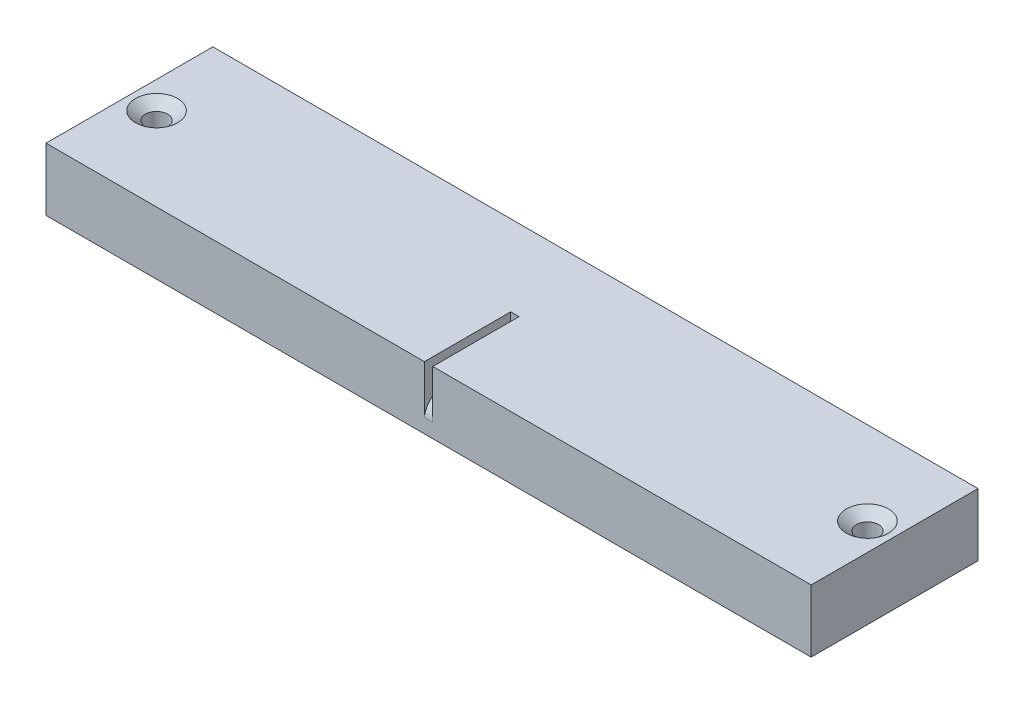
ISO-10303-21;
HEADER;
FILE_DESCRIPTION(('STEP AP214'),'2;1');
FILE_NAME('part.step','',(''),(''),'','','');
FILE_SCHEMA(('AUTOMOTIVE_DESIGN { 1 0 10303 214 1 1 1 1 }'));
ENDSEC;
DATA;
#1=APPLICATION_CONTEXT('core data for automotive mechanical design processes');
#2=APPLICATION_PROTOCOL_DEFINITION('international standard','automotive_design',2000,#1);
#3=PRODUCT_CONTEXT('',#1,'mechanical');
#4=PRODUCT('Part','Part','',(#3));
#5=PRODUCT_RELATED_PRODUCT_CATEGORY('part','',(#4));
#6=PRODUCT_DEFINITION_FORMATION('','',#4);
#7=PRODUCT_DEFINITION_CONTEXT('part definition',#1,'design');
#8=PRODUCT_DEFINITION('design','',#6,#7);
#9=PRODUCT_DEFINITION_SHAPE('','',#8);
#10=(LENGTH_UNIT() NAMED_UNIT(*) SI_UNIT(.MILLI.,.METRE.));
#11=(NAMED_UNIT(*) PLANE_ANGLE_UNIT() SI_UNIT($,.RADIAN.));
#12=(NAMED_UNIT(*) SI_UNIT($,.STERADIAN.) SOLID_ANGLE_UNIT());
#13=UNCERTAINTY_MEASURE_WITH_UNIT(LENGTH_MEASURE(1.E-05),#10,'distance_accuracy_value','');
#14=(GEOMETRIC_REPRESENTATION_CONTEXT(3) GLOBAL_UNCERTAINTY_ASSIGNED_CONTEXT((#13)) GLOBAL_UNIT_ASSIGNED_CONTEXT((#10,
#11,#12)) REPRESENTATION_CONTEXT('',''));
#15=CARTESIAN_POINT('',(0.,0.,0.));
#16=DIRECTION('',(0.,0.,1.));
#17=DIRECTION('',(1.,0.,0.));
#18=AXIS2_PLACEMENT_3D('',#15,#16,#17);
#19=CARTESIAN_POINT('',(-45.86,82.5,-0.0100000000000031));
#20=DIRECTION('',(0.,-1.,0.));
#21=DIRECTION('',(0.,0.,-1.));
#22=AXIS2_PLACEMENT_3D('',#19,#20,#21);
#23=PLANE('',#22);
#24=CARTESIAN_POINT('',(42.61,82.5,10.));
#25=DIRECTION('',(0.,-1.,0.));
#26=DIRECTION('',(0.,0.,-1.));
#27=AXIS2_PLACEMENT_3D('',#24,#25,#26);
#28=CIRCLE('',#27,1.3208);
#29=CARTESIAN_POINT('',(42.61,82.5,8.6792));
#30=VERTEX_POINT('',#29);
#31=EDGE_CURVE('E150',#30,#30,#28,.F.);
#32=ORIENTED_EDGE('',*,*,#31,.T.);
#33=EDGE_LOOP('',(#32));
#34=FACE_BOUND('',#33,.T.);
#35=DIRECTION('',(1.,0.,0.));
#36=VECTOR('',#35,1.);
#37=CARTESIAN_POINT('',(-38.36,82.5,0.));
#38=LINE('',#37,#36);
#39=CARTESIAN_POINT('',(-45.86,82.5,0.));
#40=VERTEX_POINT('',#39);
#41=CARTESIAN_POINT('',(45.86,82.5,0.));
#42=VERTEX_POINT('',#41);
#43=EDGE_CURVE('E124',#40,#42,#38,.T.);
#44=ORIENTED_EDGE('',*,*,#43,.T.);
#45=DIRECTION('',(0.,0.,1.));
#46=VECTOR('',#45,1.);
#47=CARTESIAN_POINT('',(45.86,82.5,-0.0100000000000031));
#48=LINE('',#47,#46);
#49=CARTESIAN_POINT('',(45.86,82.5,20.));
#50=VERTEX_POINT('',#49);
#51=EDGE_CURVE('E127',#42,#50,#48,.T.);
#52=ORIENTED_EDGE('',*,*,#51,.T.);
#53=DIRECTION('',(1.,0.,0.));
#54=VECTOR('',#53,1.);
#55=CARTESIAN_POINT('',(-38.36,82.5,20.));
#56=LINE('',#55,#54);
#57=CARTESIAN_POINT('',(-45.86,82.5,20.));
#58=VERTEX_POINT('',#57);
#59=EDGE_CURVE('E134',#58,#50,#56,.T.);
#60=ORIENTED_EDGE('',*,*,#59,.F.);
#61=DIRECTION('',(0.,0.,-1.));
#62=VECTOR('',#61,1.);
#63=CARTESIAN_POINT('',(-45.86,82.5,20.));
#64=LINE('',#63,#62);
#65=EDGE_CURVE('E129',#58,#40,#64,.T.);
#66=ORIENTED_EDGE('',*,*,#65,.T.);
#67=EDGE_LOOP('',(#44,#52,#60,#66));
#68=FACE_BOUND('',#67,.T.);
#69=DIRECTION('',(0.,0.,-1.));
#70=VECTOR('',#69,1.);
#71=CARTESIAN_POINT('',(0.499999999999992,82.5,9.65399692917009));
#72=LINE('',#71,#70);
#73=CARTESIAN_POINT('',(0.499999999999992,82.5,10.4024795225248));
#74=VERTEX_POINT('',#73);
#75=CARTESIAN_POINT('',(0.499999999999992,82.5,9.65399692917009));
#76=VERTEX_POINT('',#75);
#77=EDGE_CURVE('E196',#74,#76,#72,.T.);
#78=ORIENTED_EDGE('',*,*,#77,.T.);
#79=DIRECTION('',(1.,0.,0.));
#80=VECTOR('',#79,1.);
#81=CARTESIAN_POINT('',(-0.500000000000008,82.5,9.65399692917009));
#82=LINE('',#81,#80);
#83=CARTESIAN_POINT('',(-0.500000000000008,82.5,9.65399692917009));
#84=VERTEX_POINT('',#83);
#85=EDGE_CURVE('E65',#84,#76,#82,.T.);
#86=ORIENTED_EDGE('',*,*,#85,.F.);
#87=DIRECTION('',(0.,0.,-1.));
#88=VECTOR('',#87,1.);
#89=CARTESIAN_POINT('',(-0.500000000000008,82.5,9.65399692917009));
#90=LINE('',#89,#88);
#91=CARTESIAN_POINT('',(-0.500000000000007,82.5,10.4024795225248));
#92=VERTEX_POINT('',#91);
#93=EDGE_CURVE('E234',#92,#84,#90,.T.);
#94=ORIENTED_EDGE('',*,*,#93,.F.);
#95=DIRECTION('',(1.,0.,0.));
#96=VECTOR('',#95,1.);
#97=CARTESIAN_POINT('',(-0.500000000000008,82.5,10.4024795225248));
#98=LINE('',#97,#96);
#99=EDGE_CURVE('E73',#92,#74,#98,.T.);
#100=ORIENTED_EDGE('',*,*,#99,.T.);
#101=EDGE_LOOP('',(#78,#86,#94,#100));
#102=FACE_BOUND('',#101,.T.);
#103=CARTESIAN_POINT('',(-42.61,82.5,10.));
#104=DIRECTION('',(0.,-1.,0.));
#105=DIRECTION('',(0.,0.,-1.));
#106=AXIS2_PLACEMENT_3D('',#103,#104,#105);
#107=CIRCLE('',#106,1.3208);
#108=CARTESIAN_POINT('',(-42.61,82.5,8.6792));
#109=VERTEX_POINT('',#108);
#110=EDGE_CURVE('E157',#109,#109,#107,.F.);
#111=ORIENTED_EDGE('',*,*,#110,.T.);
#112=EDGE_LOOP('',(#111));
#113=FACE_BOUND('',#112,.T.);
#114=ADVANCED_FACE('F47',(#34,#68,#102,#113),#23,.T.);
#115=CARTESIAN_POINT('',(-45.86,90.,20.));
#116=DIRECTION('',(0.,1.,0.));
#117=DIRECTION('',(0.,0.,1.));
#118=AXIS2_PLACEMENT_3D('',#115,#116,#117);
#119=PLANE('',#118);
#120=CARTESIAN_POINT('',(-42.61,90.,10.));
#121=DIRECTION('',(0.,1.,0.));
#122=DIRECTION('',(0.,0.,1.));
#123=AXIS2_PLACEMENT_3D('',#120,#121,#122);
#124=CIRCLE('',#123,2.5273);
#125=CARTESIAN_POINT('',(-42.61,90.,12.5273));
#126=VERTEX_POINT('',#125);
#127=EDGE_CURVE('E11',#126,#126,#124,.T.);
#128=ORIENTED_EDGE('',*,*,#127,.F.);
#129=EDGE_LOOP('',(#128));
#130=FACE_BOUND('',#129,.T.);
#131=CARTESIAN_POINT('',(42.61,90.,10.));
#132=DIRECTION('',(0.,1.,0.));
#133=DIRECTION('',(0.,0.,1.));
#134=AXIS2_PLACEMENT_3D('',#131,#132,#133);
#135=CIRCLE('',#134,2.5273);
#136=CARTESIAN_POINT('',(42.61,90.,12.5273));
#137=VERTEX_POINT('',#136);
#138=EDGE_CURVE('E206',#137,#137,#135,.T.);
#139=ORIENTED_EDGE('',*,*,#138,.F.);
#140=EDGE_LOOP('',(#139));
#141=FACE_BOUND('',#140,.T.);
#142=DIRECTION('',(1.,0.,0.));
#143=VECTOR('',#142,1.);
#144=CARTESIAN_POINT('',(-0.500000000000009,90.,9.65399692917009));
#145=LINE('',#144,#143);
#146=CARTESIAN_POINT('',(-0.500000000000009,90.,9.65399692917009));
#147=VERTEX_POINT('',#146);
#148=CARTESIAN_POINT('',(0.499999999999991,90.,9.65399692917009));
#149=VERTEX_POINT('',#148);
#150=EDGE_CURVE('E230',#147,#149,#145,.T.);
#151=ORIENTED_EDGE('',*,*,#150,.T.);
#152=DIRECTION('',(0.,0.,1.));
#153=VECTOR('',#152,1.);
#154=CARTESIAN_POINT('',(0.499999999999991,90.,20.));
#155=LINE('',#154,#153);
#156=CARTESIAN_POINT('',(0.499999999999991,90.,20.));
#157=VERTEX_POINT('',#156);
#158=EDGE_CURVE('E143',#149,#157,#155,.T.);
#159=ORIENTED_EDGE('',*,*,#158,.T.);
#160=DIRECTION('',(-1.,0.,0.));
#161=VECTOR('',#160,1.);
#162=CARTESIAN_POINT('',(45.86,90.,20.));
#163=LINE('',#162,#161);
#164=CARTESIAN_POINT('',(45.86,90.,20.));
#165=VERTEX_POINT('',#164);
#166=EDGE_CURVE('E144',#165,#157,#163,.T.);
#167=ORIENTED_EDGE('',*,*,#166,.F.);
#168=DIRECTION('',(0.,0.,-1.));
#169=VECTOR('',#168,1.);
#170=CARTESIAN_POINT('',(45.86,90.,20.));
#171=LINE('',#170,#169);
#172=CARTESIAN_POINT('',(45.86,90.,0.));
#173=VERTEX_POINT('',#172);
#174=EDGE_CURVE('E171',#165,#173,#171,.T.);
#175=ORIENTED_EDGE('',*,*,#174,.T.);
#176=DIRECTION('',(1.,0.,0.));
#177=VECTOR('',#176,1.);
#178=CARTESIAN_POINT('',(-45.86,90.,0.));
#179=LINE('',#178,#177);
#180=CARTESIAN_POINT('',(-45.86,90.,0.));
#181=VERTEX_POINT('',#180);
#182=EDGE_CURVE('E135',#181,#173,#179,.T.);
#183=ORIENTED_EDGE('',*,*,#182,.F.);
#184=DIRECTION('',(0.,0.,-1.));
#185=VECTOR('',#184,1.);
#186=CARTESIAN_POINT('',(-45.86,90.,20.));
#187=LINE('',#186,#185);
#188=CARTESIAN_POINT('',(-45.86,90.,20.));
#189=VERTEX_POINT('',#188);
#190=EDGE_CURVE('E154',#189,#181,#187,.T.);
#191=ORIENTED_EDGE('',*,*,#190,.F.);
#192=DIRECTION('',(1.,0.,0.));
#193=VECTOR('',#192,1.);
#194=CARTESIAN_POINT('',(-45.86,90.,20.));
#195=LINE('',#194,#193);
#196=CARTESIAN_POINT('',(-0.500000000000009,90.,20.));
#197=VERTEX_POINT('',#196);
#198=EDGE_CURVE('E167',#189,#197,#195,.T.);
#199=ORIENTED_EDGE('',*,*,#198,.T.);
#200=DIRECTION('',(0.,0.,1.));
#201=VECTOR('',#200,1.);
#202=CARTESIAN_POINT('',(-0.500000000000009,90.,20.));
#203=LINE('',#202,#201);
#204=EDGE_CURVE('E182',#147,#197,#203,.T.);
#205=ORIENTED_EDGE('',*,*,#204,.F.);
#206=EDGE_LOOP('',(#151,#159,#167,#175,#183,#191,#199,#205));
#207=FACE_BOUND('',#206,.T.);
#208=ADVANCED_FACE('F222',(#130,#141,#207),#119,.T.);
#209=CARTESIAN_POINT('',(-42.61,90.,10.));
#210=DIRECTION('',(0.,1.,0.));
#211=DIRECTION('',(0.,0.,1.));
#212=AXIS2_PLACEMENT_3D('',#209,#210,#211);
#213=CYLINDRICAL_SURFACE('',#212,1.3208);
#214=CARTESIAN_POINT('',(-42.61,88.9876262949846,10.));
#215=DIRECTION('',(0.,1.,0.));
#216=DIRECTION('',(0.,0.,1.));
#217=AXIS2_PLACEMENT_3D('',#214,#215,#216);
#218=CIRCLE('',#217,1.3208);
#219=CARTESIAN_POINT('',(-42.61,88.9876262949846,11.3208));
#220=VERTEX_POINT('',#219);
#221=EDGE_CURVE('E57',#220,#220,#218,.T.);
#222=ORIENTED_EDGE('',*,*,#221,.T.);
#223=EDGE_LOOP('',(#222));
#224=FACE_BOUND('',#223,.T.);
#225=ORIENTED_EDGE('',*,*,#110,.F.);
#226=EDGE_LOOP('',(#225));
#227=FACE_BOUND('',#226,.T.);
#228=ADVANCED_FACE('F214',(#224,#227),#213,.F.);
#229=CARTESIAN_POINT('',(-42.61,90.,10.));
#230=DIRECTION('',(0.,1.,0.));
#231=DIRECTION('',(0.,0.,1.));
#232=AXIS2_PLACEMENT_3D('',#229,#230,#231);
#233=CONICAL_SURFACE('',#232,2.5273,0.872664625997166);
#234=ORIENTED_EDGE('',*,*,#221,.F.);
#235=EDGE_LOOP('',(#234));
#236=FACE_BOUND('',#235,.T.);
#237=ORIENTED_EDGE('',*,*,#127,.T.);
#238=EDGE_LOOP('',(#237));
#239=FACE_BOUND('',#238,.T.);
#240=ADVANCED_FACE('F217',(#236,#239),#233,.F.);
#241=CARTESIAN_POINT('',(42.61,90.,10.));
#242=DIRECTION('',(0.,1.,0.));
#243=DIRECTION('',(0.,0.,1.));
#244=AXIS2_PLACEMENT_3D('',#241,#242,#243);
#245=CYLINDRICAL_SURFACE('',#244,1.3208);
#246=CARTESIAN_POINT('',(42.61,88.9876262949846,10.));
#247=DIRECTION('',(0.,1.,0.));
#248=DIRECTION('',(0.,0.,1.));
#249=AXIS2_PLACEMENT_3D('',#246,#247,#248);
#250=CIRCLE('',#249,1.3208);
#251=CARTESIAN_POINT('',(42.61,88.9876262949846,11.3208));
#252=VERTEX_POINT('',#251);
#253=EDGE_CURVE('E202',#252,#252,#250,.T.);
#254=ORIENTED_EDGE('',*,*,#253,.T.);
#255=EDGE_LOOP('',(#254));
#256=FACE_BOUND('',#255,.T.);
#257=ORIENTED_EDGE('',*,*,#31,.F.);
#258=EDGE_LOOP('',(#257));
#259=FACE_BOUND('',#258,.T.);
#260=ADVANCED_FACE('F220',(#256,#259),#245,.F.);
#261=CARTESIAN_POINT('',(42.61,90.,10.));
#262=DIRECTION('',(0.,1.,0.));
#263=DIRECTION('',(0.,0.,1.));
#264=AXIS2_PLACEMENT_3D('',#261,#262,#263);
#265=CONICAL_SURFACE('',#264,2.5273,0.872664625997166);
#266=ORIENTED_EDGE('',*,*,#253,.F.);
#267=EDGE_LOOP('',(#266));
#268=FACE_BOUND('',#267,.T.);
#269=ORIENTED_EDGE('',*,*,#138,.T.);
#270=EDGE_LOOP('',(#269));
#271=FACE_BOUND('',#270,.T.);
#272=ADVANCED_FACE('F261',(#268,#271),#265,.F.);
#273=CARTESIAN_POINT('',(-0.500000000000008,83.8224633515304,15.0504568930534));
#274=DIRECTION('',(1.,0.,0.));
#275=DIRECTION('',(0.,1.,0.));
#276=AXIS2_PLACEMENT_3D('',#273,#274,#275);
#277=PLANE('',#276);
#278=DIRECTION('',(0.,1.,0.));
#279=VECTOR('',#278,1.);
#280=CARTESIAN_POINT('',(-0.500000000000009,90.,9.65399692917009));
#281=LINE('',#280,#279);
#282=EDGE_CURVE('E176',#84,#147,#281,.T.);
#283=ORIENTED_EDGE('',*,*,#282,.T.);
#284=ORIENTED_EDGE('',*,*,#204,.T.);
#285=DIRECTION('',(0.,-1.,0.));
#286=VECTOR('',#285,1.);
#287=CARTESIAN_POINT('',(-0.500000000000009,90.,20.));
#288=LINE('',#287,#286);
#289=CARTESIAN_POINT('',(-0.500000000000008,84.2032535159736,20.));
#290=VERTEX_POINT('',#289);
#291=EDGE_CURVE('E396',#197,#290,#288,.T.);
#292=ORIENTED_EDGE('',*,*,#291,.T.);
#293=CARTESIAN_POINT('',(-0.500000000000008,83.8224633515304,15.0504568930534));
#294=DIRECTION('',(-1.,0.,0.));
#295=DIRECTION('',(0.,-0.0767077292409752,-0.997053621564404));
#296=AXIS2_PLACEMENT_3D('',#293,#294,#295);
#297=ELLIPSE('',#296,4.96416942870202,3.20820921948191);
#298=EDGE_CURVE('E391',#290,#92,#297,.T.);
#299=ORIENTED_EDGE('',*,*,#298,.T.);
#300=ORIENTED_EDGE('',*,*,#93,.T.);
#301=EDGE_LOOP('',(#283,#284,#292,#299,#300));
#302=FACE_BOUND('',#301,.T.);
#303=ADVANCED_FACE('F265',(#302),#277,.T.);
#304=CARTESIAN_POINT('',(0.,0.,20.));
#305=DIRECTION('',(0.,0.,-1.));
#306=DIRECTION('',(-1.,0.,0.));
#307=AXIS2_PLACEMENT_3D('',#304,#305,#306);
#308=PLANE('',#307);
#309=ORIENTED_EDGE('',*,*,#59,.T.);
#310=DIRECTION('',(0.,-1.,0.));
#311=VECTOR('',#310,1.);
#312=CARTESIAN_POINT('',(45.86,90.,20.));
#313=LINE('',#312,#311);
#314=EDGE_CURVE('E148',#165,#50,#313,.T.);
#315=ORIENTED_EDGE('',*,*,#314,.F.);
#316=ORIENTED_EDGE('',*,*,#166,.T.);
#317=DIRECTION('',(0.,-1.,0.));
#318=VECTOR('',#317,1.);
#319=CARTESIAN_POINT('',(0.499999999999991,90.,20.));
#320=LINE('',#319,#318);
#321=CARTESIAN_POINT('',(0.499999999999992,84.2032535159736,20.));
#322=VERTEX_POINT('',#321);
#323=EDGE_CURVE('E189',#157,#322,#320,.T.);
#324=ORIENTED_EDGE('',*,*,#323,.T.);
#325=DIRECTION('',(1.,0.,0.));
#326=VECTOR('',#325,1.);
#327=CARTESIAN_POINT('',(-0.500000000000008,84.2032535159736,20.));
#328=LINE('',#327,#326);
#329=EDGE_CURVE('E235',#290,#322,#328,.T.);
#330=ORIENTED_EDGE('',*,*,#329,.F.);
#331=ORIENTED_EDGE('',*,*,#291,.F.);
#332=ORIENTED_EDGE('',*,*,#198,.F.);
#333=DIRECTION('',(0.,-1.,0.));
#334=VECTOR('',#333,1.);
#335=CARTESIAN_POINT('',(-45.86,90.,20.));
#336=LINE('',#335,#334);
#337=EDGE_CURVE('E163',#189,#58,#336,.T.);
#338=ORIENTED_EDGE('',*,*,#337,.T.);
#339=EDGE_LOOP('',(#309,#315,#316,#324,#330,#331,#332,#338));
#340=FACE_BOUND('',#339,.T.);
#341=ADVANCED_FACE('F250',(#340),#308,.F.);
#342=DIRECTION('',(1.,0.,0.));
#343=VECTOR('',#342,1.);
#344=SURFACE_OF_LINEAR_EXTRUSION('',#297,#343);
#345=ORIENTED_EDGE('',*,*,#329,.T.);
#346=CARTESIAN_POINT('',(0.499999999999992,83.8224633515304,15.0504568930534));
#347=DIRECTION('',(-1.,0.,0.));
#348=DIRECTION('',(0.,-0.0767077292409752,-0.997053621564404));
#349=AXIS2_PLACEMENT_3D('',#346,#347,#348);
#350=ELLIPSE('',#349,4.96416942870202,3.20820921948191);
#351=EDGE_CURVE('E193',#322,#74,#350,.T.);
#352=ORIENTED_EDGE('',*,*,#351,.T.);
#353=ORIENTED_EDGE('',*,*,#99,.F.);
#354=ORIENTED_EDGE('',*,*,#298,.F.);
#355=EDGE_LOOP('',(#345,#352,#353,#354));
#356=FACE_BOUND('',#355,.T.);
#357=ADVANCED_FACE('F243',(#356),#344,.F.);
#358=CARTESIAN_POINT('',(-0.500000000000009,90.,9.65399692917009));
#359=DIRECTION('',(0.,0.,-1.));
#360=DIRECTION('',(-1.,0.,0.));
#361=AXIS2_PLACEMENT_3D('',#358,#359,#360);
#362=PLANE('',#361);
#363=ORIENTED_EDGE('',*,*,#85,.T.);
#364=DIRECTION('',(0.,1.,0.));
#365=VECTOR('',#364,1.);
#366=CARTESIAN_POINT('',(0.499999999999991,90.,9.65399692917009));
#367=LINE('',#366,#365);
#368=EDGE_CURVE('E199',#76,#149,#367,.T.);
#369=ORIENTED_EDGE('',*,*,#368,.T.);
#370=ORIENTED_EDGE('',*,*,#150,.F.);
#371=ORIENTED_EDGE('',*,*,#282,.F.);
#372=EDGE_LOOP('',(#363,#369,#370,#371));
#373=FACE_BOUND('',#372,.T.);
#374=ADVANCED_FACE('F241',(#373),#362,.F.);
#375=CARTESIAN_POINT('',(0.499999999999992,83.8224633515304,15.0504568930534));
#376=DIRECTION('',(-1.,0.,0.));
#377=DIRECTION('',(0.,1.,0.));
#378=AXIS2_PLACEMENT_3D('',#375,#376,#377);
#379=PLANE('',#378);
#380=ORIENTED_EDGE('',*,*,#368,.F.);
#381=ORIENTED_EDGE('',*,*,#77,.F.);
#382=ORIENTED_EDGE('',*,*,#351,.F.);
#383=ORIENTED_EDGE('',*,*,#323,.F.);
#384=ORIENTED_EDGE('',*,*,#158,.F.);
#385=EDGE_LOOP('',(#380,#381,#382,#383,#384));
#386=FACE_BOUND('',#385,.T.);
#387=ADVANCED_FACE('F238',(#386),#379,.T.);
#388=CARTESIAN_POINT('',(45.86,90.,20.));
#389=DIRECTION('',(1.,0.,0.));
#390=DIRECTION('',(0.,1.,0.));
#391=AXIS2_PLACEMENT_3D('',#388,#389,#390);
#392=PLANE('',#391);
#393=ORIENTED_EDGE('',*,*,#51,.F.);
#394=DIRECTION('',(0.,-1.,0.));
#395=VECTOR('',#394,1.);
#396=CARTESIAN_POINT('',(45.86,90.,0.));
#397=LINE('',#396,#395);
#398=EDGE_CURVE('E51',#173,#42,#397,.T.);
#399=ORIENTED_EDGE('',*,*,#398,.F.);
#400=ORIENTED_EDGE('',*,*,#174,.F.);
#401=ORIENTED_EDGE('',*,*,#314,.T.);
#402=EDGE_LOOP('',(#393,#399,#400,#401));
#403=FACE_BOUND('',#402,.T.);
#404=ADVANCED_FACE('F146',(#403),#392,.T.);
#405=CARTESIAN_POINT('',(0.,0.,0.));
#406=DIRECTION('',(0.,0.,-1.));
#407=DIRECTION('',(-1.,0.,0.));
#408=AXIS2_PLACEMENT_3D('',#405,#406,#407);
#409=PLANE('',#408);
#410=ORIENTED_EDGE('',*,*,#398,.T.);
#411=ORIENTED_EDGE('',*,*,#43,.F.);
#412=DIRECTION('',(0.,-1.,0.));
#413=VECTOR('',#412,1.);
#414=CARTESIAN_POINT('',(-45.86,90.,0.));
#415=LINE('',#414,#413);
#416=EDGE_CURVE('E168',#181,#40,#415,.T.);
#417=ORIENTED_EDGE('',*,*,#416,.F.);
#418=ORIENTED_EDGE('',*,*,#182,.T.);
#419=EDGE_LOOP('',(#410,#411,#417,#418));
#420=FACE_BOUND('',#419,.T.);
#421=ADVANCED_FACE('F138',(#420),#409,.T.);
#422=CARTESIAN_POINT('',(-45.86,90.,20.));
#423=DIRECTION('',(1.,0.,0.));
#424=DIRECTION('',(0.,1.,0.));
#425=AXIS2_PLACEMENT_3D('',#422,#423,#424);
#426=PLANE('',#425);
#427=ORIENTED_EDGE('',*,*,#65,.F.);
#428=ORIENTED_EDGE('',*,*,#337,.F.);
#429=ORIENTED_EDGE('',*,*,#190,.T.);
#430=ORIENTED_EDGE('',*,*,#416,.T.);
#431=EDGE_LOOP('',(#427,#428,#429,#430));
#432=FACE_BOUND('',#431,.T.);
#433=ADVANCED_FACE('F49',(#432),#426,.F.);
#434=CLOSED_SHELL('',(#114,#208,#228,#240,#260,#272,#303,#341,#357,#374,#387,#404,#421,#433));
#435=MANIFOLD_SOLID_BREP('B2',#434);
#436=ADVANCED_BREP_SHAPE_REPRESENTATION('',(#18,#435),#14);
#437=SHAPE_DEFINITION_REPRESENTATION(#9,#436);
ENDSEC;
END-ISO-10303-21;
